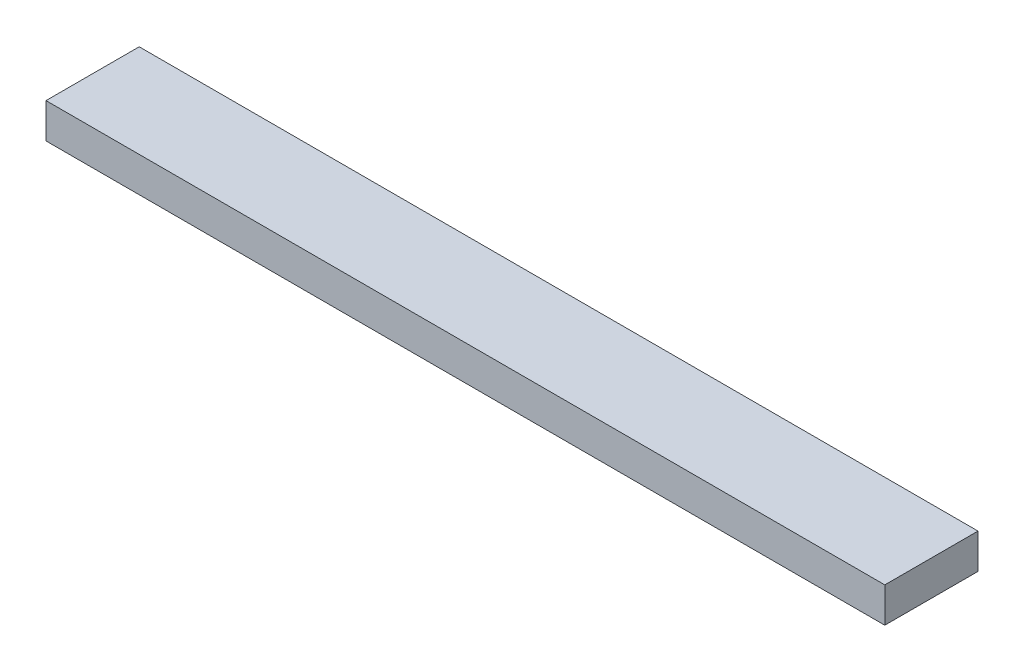
ISO-10303-21;
HEADER;
FILE_DESCRIPTION(('STEP AP214'),'2;1');
FILE_NAME('part.step','',(''),(''),'','','');
FILE_SCHEMA(('AUTOMOTIVE_DESIGN { 1 0 10303 214 1 1 1 1 }'));
ENDSEC;
DATA;
#1=APPLICATION_CONTEXT('core data for automotive mechanical design processes');
#2=APPLICATION_PROTOCOL_DEFINITION('international standard','automotive_design',2000,#1);
#3=PRODUCT_CONTEXT('',#1,'mechanical');
#4=PRODUCT('Part','Part','',(#3));
#5=PRODUCT_RELATED_PRODUCT_CATEGORY('part','',(#4));
#6=PRODUCT_DEFINITION_FORMATION('','',#4);
#7=PRODUCT_DEFINITION_CONTEXT('part definition',#1,'design');
#8=PRODUCT_DEFINITION('design','',#6,#7);
#9=PRODUCT_DEFINITION_SHAPE('','',#8);
#10=(LENGTH_UNIT() NAMED_UNIT(*) SI_UNIT(.MILLI.,.METRE.));
#11=(NAMED_UNIT(*) PLANE_ANGLE_UNIT() SI_UNIT($,.RADIAN.));
#12=(NAMED_UNIT(*) SI_UNIT($,.STERADIAN.) SOLID_ANGLE_UNIT());
#13=UNCERTAINTY_MEASURE_WITH_UNIT(LENGTH_MEASURE(1.E-05),#10,'distance_accuracy_value','');
#14=(GEOMETRIC_REPRESENTATION_CONTEXT(3) GLOBAL_UNCERTAINTY_ASSIGNED_CONTEXT((#13)) GLOBAL_UNIT_ASSIGNED_CONTEXT((#10,
#11,#12)) REPRESENTATION_CONTEXT('',''));
#15=CARTESIAN_POINT('',(0.,0.,0.));
#16=DIRECTION('',(0.,0.,1.));
#17=DIRECTION('',(1.,0.,0.));
#18=AXIS2_PLACEMENT_3D('',#15,#16,#17);
#19=CARTESIAN_POINT('',(228.6,19.05,25.4));
#20=DIRECTION('',(-1.,0.,0.));
#21=DIRECTION('',(0.,0.,1.));
#22=AXIS2_PLACEMENT_3D('',#19,#20,#21);
#23=PLANE('',#22);
#24=DIRECTION('',(0.,0.,-1.));
#25=VECTOR('',#24,1.);
#26=CARTESIAN_POINT('',(228.6,0.,25.4));
#27=LINE('',#26,#25);
#28=CARTESIAN_POINT('',(228.6,0.,25.4));
#29=VERTEX_POINT('',#28);
#30=CARTESIAN_POINT('',(228.6,0.,-25.4));
#31=VERTEX_POINT('',#30);
#32=EDGE_CURVE('E96',#29,#31,#27,.T.);
#33=ORIENTED_EDGE('',*,*,#32,.T.);
#34=DIRECTION('',(0.,-1.,0.));
#35=VECTOR('',#34,1.);
#36=CARTESIAN_POINT('',(228.6,19.05,-25.4));
#37=LINE('',#36,#35);
#38=CARTESIAN_POINT('',(228.6,19.05,-25.4));
#39=VERTEX_POINT('',#38);
#40=EDGE_CURVE('E11',#39,#31,#37,.T.);
#41=ORIENTED_EDGE('',*,*,#40,.F.);
#42=DIRECTION('',(0.,0.,-1.));
#43=VECTOR('',#42,1.);
#44=CARTESIAN_POINT('',(228.6,19.05,25.4));
#45=LINE('',#44,#43);
#46=CARTESIAN_POINT('',(228.6,19.05,25.4));
#47=VERTEX_POINT('',#46);
#48=EDGE_CURVE('E84',#47,#39,#45,.T.);
#49=ORIENTED_EDGE('',*,*,#48,.F.);
#50=DIRECTION('',(0.,-1.,0.));
#51=VECTOR('',#50,1.);
#52=CARTESIAN_POINT('',(228.6,19.05,25.4));
#53=LINE('',#52,#51);
#54=EDGE_CURVE('E92',#47,#29,#53,.T.);
#55=ORIENTED_EDGE('',*,*,#54,.T.);
#56=EDGE_LOOP('',(#33,#41,#49,#55));
#57=FACE_BOUND('',#56,.T.);
#58=ADVANCED_FACE('F33',(#57),#23,.F.);
#59=CARTESIAN_POINT('',(-228.6,19.05,-25.4));
#60=DIRECTION('',(0.,0.,1.));
#61=DIRECTION('',(1.,0.,0.));
#62=AXIS2_PLACEMENT_3D('',#59,#60,#61);
#63=PLANE('',#62);
#64=DIRECTION('',(-1.,0.,0.));
#65=VECTOR('',#64,1.);
#66=CARTESIAN_POINT('',(-228.6,0.,-25.4));
#67=LINE('',#66,#65);
#68=CARTESIAN_POINT('',(-228.6,0.,-25.4));
#69=VERTEX_POINT('',#68);
#70=EDGE_CURVE('E88',#31,#69,#67,.T.);
#71=ORIENTED_EDGE('',*,*,#70,.T.);
#72=DIRECTION('',(0.,-1.,0.));
#73=VECTOR('',#72,1.);
#74=CARTESIAN_POINT('',(-228.6,19.05,-25.4));
#75=LINE('',#74,#73);
#76=CARTESIAN_POINT('',(-228.6,19.05,-25.4));
#77=VERTEX_POINT('',#76);
#78=EDGE_CURVE('E41',#77,#69,#75,.T.);
#79=ORIENTED_EDGE('',*,*,#78,.F.);
#80=DIRECTION('',(-1.,0.,0.));
#81=VECTOR('',#80,1.);
#82=CARTESIAN_POINT('',(-228.6,19.05,-25.4));
#83=LINE('',#82,#81);
#84=EDGE_CURVE('E79',#39,#77,#83,.T.);
#85=ORIENTED_EDGE('',*,*,#84,.F.);
#86=ORIENTED_EDGE('',*,*,#40,.T.);
#87=EDGE_LOOP('',(#71,#79,#85,#86));
#88=FACE_BOUND('',#87,.T.);
#89=ADVANCED_FACE('F87',(#88),#63,.F.);
#90=CARTESIAN_POINT('',(-228.6,19.05,25.4));
#91=DIRECTION('',(1.,0.,0.));
#92=DIRECTION('',(0.,0.,-1.));
#93=AXIS2_PLACEMENT_3D('',#90,#91,#92);
#94=PLANE('',#93);
#95=DIRECTION('',(0.,0.,1.));
#96=VECTOR('',#95,1.);
#97=CARTESIAN_POINT('',(-228.6,0.,25.4));
#98=LINE('',#97,#96);
#99=CARTESIAN_POINT('',(-228.6,0.,25.4));
#100=VERTEX_POINT('',#99);
#101=EDGE_CURVE('E66',#69,#100,#98,.T.);
#102=ORIENTED_EDGE('',*,*,#101,.T.);
#103=DIRECTION('',(0.,-1.,0.));
#104=VECTOR('',#103,1.);
#105=CARTESIAN_POINT('',(-228.6,19.05,25.4));
#106=LINE('',#105,#104);
#107=CARTESIAN_POINT('',(-228.6,19.05,25.4));
#108=VERTEX_POINT('',#107);
#109=EDGE_CURVE('E89',#108,#100,#106,.T.);
#110=ORIENTED_EDGE('',*,*,#109,.F.);
#111=DIRECTION('',(0.,0.,1.));
#112=VECTOR('',#111,1.);
#113=CARTESIAN_POINT('',(-228.6,19.05,25.4));
#114=LINE('',#113,#112);
#115=EDGE_CURVE('E82',#77,#108,#114,.T.);
#116=ORIENTED_EDGE('',*,*,#115,.F.);
#117=ORIENTED_EDGE('',*,*,#78,.T.);
#118=EDGE_LOOP('',(#102,#110,#116,#117));
#119=FACE_BOUND('',#118,.T.);
#120=ADVANCED_FACE('F90',(#119),#94,.F.);
#121=CARTESIAN_POINT('',(-228.6,19.05,25.4));
#122=DIRECTION('',(0.,0.,-1.));
#123=DIRECTION('',(-1.,0.,0.));
#124=AXIS2_PLACEMENT_3D('',#121,#122,#123);
#125=PLANE('',#124);
#126=DIRECTION('',(1.,0.,0.));
#127=VECTOR('',#126,1.);
#128=CARTESIAN_POINT('',(-228.6,0.,25.4));
#129=LINE('',#128,#127);
#130=EDGE_CURVE('E72',#100,#29,#129,.T.);
#131=ORIENTED_EDGE('',*,*,#130,.T.);
#132=ORIENTED_EDGE('',*,*,#54,.F.);
#133=DIRECTION('',(1.,0.,0.));
#134=VECTOR('',#133,1.);
#135=CARTESIAN_POINT('',(-228.6,19.05,25.4));
#136=LINE('',#135,#134);
#137=EDGE_CURVE('E49',#108,#47,#136,.T.);
#138=ORIENTED_EDGE('',*,*,#137,.F.);
#139=ORIENTED_EDGE('',*,*,#109,.T.);
#140=EDGE_LOOP('',(#131,#132,#138,#139));
#141=FACE_BOUND('',#140,.T.);
#142=ADVANCED_FACE('F103',(#141),#125,.F.);
#143=CARTESIAN_POINT('',(0.,19.05,0.));
#144=DIRECTION('',(0.,-1.,0.));
#145=DIRECTION('',(0.,0.,-1.));
#146=AXIS2_PLACEMENT_3D('',#143,#144,#145);
#147=PLANE('',#146);
#148=ORIENTED_EDGE('',*,*,#48,.T.);
#149=ORIENTED_EDGE('',*,*,#84,.T.);
#150=ORIENTED_EDGE('',*,*,#115,.T.);
#151=ORIENTED_EDGE('',*,*,#137,.T.);
#152=EDGE_LOOP('',(#148,#149,#150,#151));
#153=FACE_BOUND('',#152,.T.);
#154=ADVANCED_FACE('F80',(#153),#147,.F.);
#155=CARTESIAN_POINT('',(0.,0.,0.));
#156=DIRECTION('',(0.,-1.,0.));
#157=DIRECTION('',(0.,0.,-1.));
#158=AXIS2_PLACEMENT_3D('',#155,#156,#157);
#159=PLANE('',#158);
#160=ORIENTED_EDGE('',*,*,#32,.F.);
#161=ORIENTED_EDGE('',*,*,#130,.F.);
#162=ORIENTED_EDGE('',*,*,#101,.F.);
#163=ORIENTED_EDGE('',*,*,#70,.F.);
#164=EDGE_LOOP('',(#160,#161,#162,#163));
#165=FACE_BOUND('',#164,.T.);
#166=ADVANCED_FACE('F106',(#165),#159,.T.);
#167=CLOSED_SHELL('',(#58,#89,#120,#142,#154,#166));
#168=MANIFOLD_SOLID_BREP('B2',#167);
#169=ADVANCED_BREP_SHAPE_REPRESENTATION('',(#18,#168),#14);
#170=SHAPE_DEFINITION_REPRESENTATION(#9,#169);
ENDSEC;
END-ISO-10303-21;
